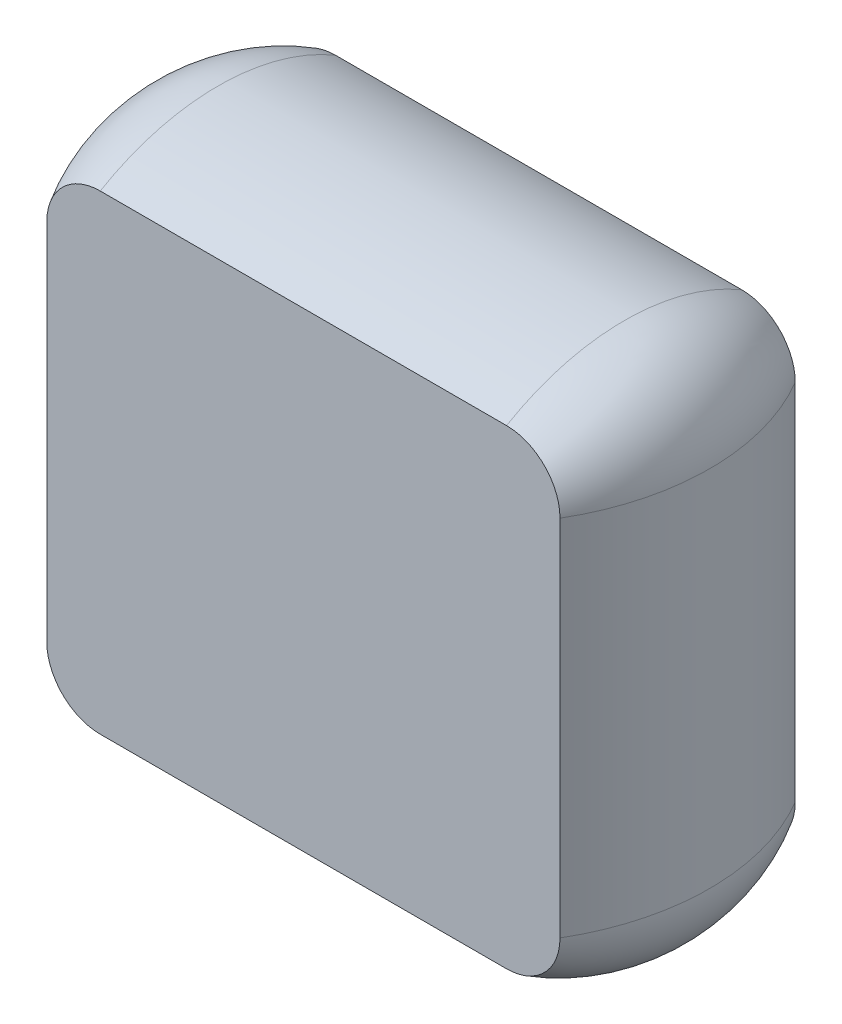
ISO-10303-21;
HEADER;
FILE_DESCRIPTION(('STEP AP214'),'2;1');
FILE_NAME('part.step','',(''),(''),'','','');
FILE_SCHEMA(('AUTOMOTIVE_DESIGN { 1 0 10303 214 1 1 1 1 }'));
ENDSEC;
DATA;
#1=APPLICATION_CONTEXT('core data for automotive mechanical design processes');
#2=APPLICATION_PROTOCOL_DEFINITION('international standard','automotive_design',2000,#1);
#3=PRODUCT_CONTEXT('',#1,'mechanical');
#4=PRODUCT('Part','Part','',(#3));
#5=PRODUCT_RELATED_PRODUCT_CATEGORY('part','',(#4));
#6=PRODUCT_DEFINITION_FORMATION('','',#4);
#7=PRODUCT_DEFINITION_CONTEXT('part definition',#1,'design');
#8=PRODUCT_DEFINITION('design','',#6,#7);
#9=PRODUCT_DEFINITION_SHAPE('','',#8);
#10=(LENGTH_UNIT() NAMED_UNIT(*) SI_UNIT(.MILLI.,.METRE.));
#11=(NAMED_UNIT(*) PLANE_ANGLE_UNIT() SI_UNIT($,.RADIAN.));
#12=(NAMED_UNIT(*) SI_UNIT($,.STERADIAN.) SOLID_ANGLE_UNIT());
#13=UNCERTAINTY_MEASURE_WITH_UNIT(LENGTH_MEASURE(1.E-05),#10,'distance_accuracy_value','');
#14=(GEOMETRIC_REPRESENTATION_CONTEXT(3) GLOBAL_UNCERTAINTY_ASSIGNED_CONTEXT((#13)) GLOBAL_UNIT_ASSIGNED_CONTEXT((#10,
#11,#12)) REPRESENTATION_CONTEXT('',''));
#15=CARTESIAN_POINT('',(0.,0.,0.));
#16=DIRECTION('',(0.,0.,1.));
#17=DIRECTION('',(1.,0.,0.));
#18=AXIS2_PLACEMENT_3D('',#15,#16,#17);
#19=CARTESIAN_POINT('',(27.50000122,80.000000627975,-1.926522083282));
#20=DIRECTION('',(0.,8.74227765658197E-08,-0.999999999999996));
#21=DIRECTION('',(0.,0.999999999999996,8.74227765658197E-08));
#22=AXIS2_PLACEMENT_3D('',#19,#20,#21);
#23=PLANE('',#22);
#24=CARTESIAN_POINT('',(28.450001145691,79.1500005449226,-1.92652215759224));
#25=DIRECTION('',(0.,-8.74240003306815E-08,0.999999999999996));
#26=DIRECTION('',(0.,-0.999999999999996,-8.74240003306815E-08));
#27=AXIS2_PLACEMENT_3D('',#24,#25,#26);
#28=CIRCLE('',#27,0.249999999998537);
#29=CARTESIAN_POINT('',(28.4500011238352,78.900000544924,-1.92652217944813));
#30=VERTEX_POINT('',#29);
#31=CARTESIAN_POINT('',(28.7000011456899,79.1500005230674,-1.92652215759209));
#32=VERTEX_POINT('',#31);
#33=EDGE_CURVE('E21',#30,#32,#28,.T.);
#34=ORIENTED_EDGE('',*,*,#33,.T.);
#35=DIRECTION('',(8.74227767010293E-08,0.999999999999992,8.74227765658193E-08));
#36=VECTOR('',#35,1.);
#37=CARTESIAN_POINT('',(28.7000011456899,79.1500005230679,-1.92652215759194));
#38=LINE('',#37,#36);
#39=CARTESIAN_POINT('',(28.700001294309,80.8500005230675,-1.92652200897359));
#40=VERTEX_POINT('',#39);
#41=EDGE_CURVE('E111',#40,#32,#38,.F.);
#42=ORIENTED_EDGE('',*,*,#41,.F.);
#43=CARTESIAN_POINT('',(28.450001294309,80.8500005449226,-1.92652200897359));
#44=DIRECTION('',(0.,-8.74240020654048E-08,0.999999999999996));
#45=DIRECTION('',(0.,-0.999999999999996,-8.74240020654048E-08));
#46=AXIS2_PLACEMENT_3D('',#43,#44,#45);
#47=CIRCLE('',#46,0.250000000000322);
#48=CARTESIAN_POINT('',(28.4500013161648,81.1000005449233,-1.92652198711742));
#49=VERTEX_POINT('',#48);
#50=EDGE_CURVE('E113',#40,#49,#47,.T.);
#51=ORIENTED_EDGE('',*,*,#50,.T.);
#52=DIRECTION('',(-0.999999999999996,8.74227762310997E-08,0.));
#53=VECTOR('',#52,1.);
#54=CARTESIAN_POINT('',(28.4500013161646,81.1000005449233,-1.92652198711725));
#55=LINE('',#54,#53);
#56=CARTESIAN_POINT('',(26.5500013161648,81.1000007110266,-1.92652198711663));
#57=VERTEX_POINT('',#56);
#58=EDGE_CURVE('E106',#57,#49,#55,.F.);
#59=ORIENTED_EDGE('',*,*,#58,.F.);
#60=CARTESIAN_POINT('',(26.550001294309,80.8500007110256,-1.92652200897203));
#61=DIRECTION('',(0.,-8.74240020654051E-08,0.999999999999996));
#62=DIRECTION('',(0.,-0.999999999999996,-8.74240020654051E-08));
#63=AXIS2_PLACEMENT_3D('',#60,#61,#62);
#64=CIRCLE('',#63,0.250000000001015);
#65=CARTESIAN_POINT('',(26.3000012943098,80.8500007328822,-1.92652200897269));
#66=VERTEX_POINT('',#65);
#67=EDGE_CURVE('E109',#57,#66,#64,.T.);
#68=ORIENTED_EDGE('',*,*,#67,.T.);
#69=DIRECTION('',(-8.74227769561393E-08,-0.999999999999992,-8.74227765658193E-08));
#70=VECTOR('',#69,1.);
#71=CARTESIAN_POINT('',(26.3000012943098,80.8500007328831,-1.92652200897335));
#72=LINE('',#71,#70);
#73=CARTESIAN_POINT('',(26.3000011456911,79.1500007328821,-1.92652215759138));
#74=VERTEX_POINT('',#73);
#75=EDGE_CURVE('E102',#74,#66,#72,.F.);
#76=ORIENTED_EDGE('',*,*,#75,.F.);
#77=CARTESIAN_POINT('',(26.550001145691,79.1500007110256,-1.92652215759069));
#78=DIRECTION('',(0.,-8.74240003306815E-08,0.999999999999996));
#79=DIRECTION('',(0.,-0.999999999999996,-8.74240003306815E-08));
#80=AXIS2_PLACEMENT_3D('',#77,#78,#79);
#81=CIRCLE('',#80,0.249999999999187);
#82=CARTESIAN_POINT('',(26.5500011238351,78.9000007110273,-1.92652217944735));
#83=VERTEX_POINT('',#82);
#84=EDGE_CURVE('E94',#74,#83,#81,.T.);
#85=ORIENTED_EDGE('',*,*,#84,.T.);
#86=DIRECTION('',(0.999999999999996,-8.74227762310997E-08,0.));
#87=VECTOR('',#86,1.);
#88=CARTESIAN_POINT('',(26.5500011238354,78.9000007110273,-1.926522179448));
#89=LINE('',#88,#87);
#90=EDGE_CURVE('E91',#30,#83,#89,.F.);
#91=ORIENTED_EDGE('',*,*,#90,.F.);
#92=EDGE_LOOP('',(#34,#42,#51,#59,#68,#76,#85,#91));
#93=FACE_BOUND('',#92,.T.);
#94=ADVANCED_FACE('F17',(#93),#23,.F.);
#95=CARTESIAN_POINT('',(28.450001145691,79.1500005930058,-2.47652215759351));
#96=DIRECTION('',(0.,-8.74240003306815E-08,0.999999999999996));
#97=DIRECTION('',(0.,-0.999999999999996,-8.74240003306815E-08));
#98=AXIS2_PLACEMENT_3D('',#95,#96,#97);
#99=DEGENERATE_TOROIDAL_SURFACE('',#98,0.683333333333,1.08333333333244,.F.);
#100=CARTESIAN_POINT('',(28.450001145691,79.150000641089,-3.02652215759185));
#101=DIRECTION('',(0.,-8.74240003306815E-08,0.999999999999996));
#102=DIRECTION('',(0.,-0.999999999999996,-8.74240003306815E-08));
#103=AXIS2_PLACEMENT_3D('',#100,#101,#102);
#104=CIRCLE('',#103,0.250000000000271);
#105=CARTESIAN_POINT('',(28.450001134763,78.9000007241406,-3.02652217944784));
#106=VERTEX_POINT('',#105);
#107=CARTESIAN_POINT('',(28.7000011456906,79.150000630161,-3.02652215759169));
#108=VERTEX_POINT('',#107);
#109=EDGE_CURVE('E95',#106,#108,#104,.T.);
#110=ORIENTED_EDGE('',*,*,#109,.T.);
#111=CARTESIAN_POINT('',(27.766667812357,79.1500006527451,-2.476522157592));
#112=DIRECTION('',(8.74227767010293E-08,0.999999999999992,8.74227765658193E-08));
#113=DIRECTION('',(-0.999999999999996,8.74227767010297E-08,0.));
#114=AXIS2_PLACEMENT_3D('',#111,#112,#113);
#115=CIRCLE('',#114,1.083333333333);
#116=EDGE_CURVE('E85',#32,#108,#115,.T.);
#117=ORIENTED_EDGE('',*,*,#116,.F.);
#118=ORIENTED_EDGE('',*,*,#33,.F.);
#119=CARTESIAN_POINT('',(28.4500012054296,79.8333339263397,-2.47652209785301));
#120=DIRECTION('',(0.999999999999996,-8.74227762310997E-08,0.));
#121=DIRECTION('',(8.74227762310997E-08,0.999999999999996,0.));
#122=AXIS2_PLACEMENT_3D('',#119,#120,#121);
#123=CIRCLE('',#122,1.083333333333);
#124=EDGE_CURVE('E84',#106,#30,#123,.F.);
#125=ORIENTED_EDGE('',*,*,#124,.F.);
#126=EDGE_LOOP('',(#110,#117,#118,#125));
#127=FACE_BOUND('',#126,.T.);
#128=ADVANCED_FACE('F83',(#127),#99,.F.);
#129=CARTESIAN_POINT('',(27.766667812357,79.150000652745,-2.476522157592));
#130=DIRECTION('',(8.74227767010293E-08,0.999999999999992,8.74227765658193E-08));
#131=DIRECTION('',(-0.999999999999996,8.74227767010297E-08,0.));
#132=AXIS2_PLACEMENT_3D('',#129,#130,#131);
#133=CYLINDRICAL_SURFACE('',#132,1.083333333333);
#134=CARTESIAN_POINT('',(27.7666679609753,80.8500006527456,-2.476522008973));
#135=DIRECTION('',(-8.74232978632893E-08,-0.999999999999992,-8.7422720577863E-08));
#136=DIRECTION('',(0.861538461538556,-3.09346907064558E-08,-0.507692307692146));
#137=AXIS2_PLACEMENT_3D('',#134,#135,#136);
#138=CIRCLE('',#137,1.08333333333367);
#139=CARTESIAN_POINT('',(28.70000122,80.850000630161,-3.0265220089731));
#140=VERTEX_POINT('',#139);
#141=EDGE_CURVE('E127',#140,#40,#138,.T.);
#142=ORIENTED_EDGE('',*,*,#141,.T.);
#143=ORIENTED_EDGE('',*,*,#41,.T.);
#144=ORIENTED_EDGE('',*,*,#116,.T.);
#145=DIRECTION('',(0.,-0.999999999999996,-8.74227765658197E-08));
#146=VECTOR('',#145,1.);
#147=CARTESIAN_POINT('',(28.700001145691,79.150000641089,-3.026522157592));
#148=LINE('',#147,#146);
#149=EDGE_CURVE('E97',#108,#140,#148,.F.);
#150=ORIENTED_EDGE('',*,*,#149,.T.);
#151=EDGE_LOOP('',(#142,#143,#144,#150));
#152=FACE_BOUND('',#151,.T.);
#153=ADVANCED_FACE('F162',(#152),#133,.T.);
#154=CARTESIAN_POINT('',(28.450001294309,80.8500005930058,-2.47652200897299));
#155=DIRECTION('',(0.,-8.74240020654048E-08,0.999999999999996));
#156=DIRECTION('',(0.,-0.999999999999996,-8.74240020654048E-08));
#157=AXIS2_PLACEMENT_3D('',#154,#155,#156);
#158=DEGENERATE_TOROIDAL_SURFACE('',#157,0.68333333333375,1.08333333333367,.F.);
#159=CARTESIAN_POINT('',(28.450001294309,80.850000641089,-3.0265220089732));
#160=DIRECTION('',(0.,-8.74240020654048E-08,0.999999999999996));
#161=DIRECTION('',(0.,-0.999999999999996,-8.74240020654048E-08));
#162=AXIS2_PLACEMENT_3D('',#159,#160,#161);
#163=CIRCLE('',#162,0.249999999999851);
#164=CARTESIAN_POINT('',(28.450001305237,81.1000006410889,-3.02652198711704));
#165=VERTEX_POINT('',#164);
#166=EDGE_CURVE('E121',#140,#165,#163,.T.);
#167=ORIENTED_EDGE('',*,*,#166,.T.);
#168=CARTESIAN_POINT('',(28.4500012345704,80.166667259673,-2.476522068712));
#169=DIRECTION('',(-0.999999999999996,8.74227762310997E-08,0.));
#170=DIRECTION('',(-8.74227762310997E-08,-0.999999999999996,0.));
#171=AXIS2_PLACEMENT_3D('',#168,#169,#170);
#172=CIRCLE('',#171,1.083333333333);
#173=EDGE_CURVE('E110',#49,#165,#172,.T.);
#174=ORIENTED_EDGE('',*,*,#173,.F.);
#175=ORIENTED_EDGE('',*,*,#50,.F.);
#176=ORIENTED_EDGE('',*,*,#141,.F.);
#177=EDGE_LOOP('',(#167,#174,#175,#176));
#178=FACE_BOUND('',#177,.T.);
#179=ADVANCED_FACE('F161',(#178),#158,.F.);
#180=CARTESIAN_POINT('',(28.45000123457,80.166667259673,-2.476522068712));
#181=DIRECTION('',(-0.999999999999996,8.74227762310997E-08,0.));
#182=DIRECTION('',(-8.74227762310997E-08,-0.999999999999996,0.));
#183=AXIS2_PLACEMENT_3D('',#180,#181,#182);
#184=CYLINDRICAL_SURFACE('',#183,1.083333333333);
#185=CARTESIAN_POINT('',(26.5500012345714,80.1666674257772,-2.47652206871122));
#186=DIRECTION('',(0.999999999999996,-8.74217028733307E-08,0.));
#187=DIRECTION('',(7.53171595604359E-08,0.861538505921933,-0.507692232374887));
#188=AXIS2_PLACEMENT_3D('',#185,#186,#187);
#189=CIRCLE('',#188,1.08333333333247);
#190=CARTESIAN_POINT('',(26.550001305237,81.1000007241404,-3.02652198711715));
#191=VERTEX_POINT('',#190);
#192=EDGE_CURVE('E126',#191,#57,#189,.T.);
#193=ORIENTED_EDGE('',*,*,#192,.T.);
#194=ORIENTED_EDGE('',*,*,#58,.T.);
#195=ORIENTED_EDGE('',*,*,#173,.T.);
#196=DIRECTION('',(1.,0.,0.));
#197=VECTOR('',#196,1.);
#198=CARTESIAN_POINT('',(28.450001145691,81.100000641089,-3.02652198711759));
#199=LINE('',#198,#197);
#200=EDGE_CURVE('E120',#165,#191,#199,.F.);
#201=ORIENTED_EDGE('',*,*,#200,.T.);
#202=EDGE_LOOP('',(#193,#194,#195,#201));
#203=FACE_BOUND('',#202,.T.);
#204=ADVANCED_FACE('F156',(#203),#184,.T.);
#205=CARTESIAN_POINT('',(26.550001294309,80.8500007591088,-2.47652200897148));
#206=DIRECTION('',(0.,-8.74240020654051E-08,0.999999999999996));
#207=DIRECTION('',(0.,-0.999999999999996,-8.74240020654051E-08));
#208=AXIS2_PLACEMENT_3D('',#205,#206,#207);
#209=DEGENERATE_TOROIDAL_SURFACE('',#208,0.68333333333164,1.08333333333247,.F.);
#210=CARTESIAN_POINT('',(26.550001294309,80.850000807192,-3.02652200897334));
#211=DIRECTION('',(0.,-8.74240020654051E-08,0.999999999999996));
#212=DIRECTION('',(0.,-0.999999999999996,-8.74240020654051E-08));
#213=AXIS2_PLACEMENT_3D('',#210,#211,#212);
#214=CIRCLE('',#213,0.249999999999603);
#215=CARTESIAN_POINT('',(26.3000012943094,80.85000081812,-3.02652200897294));
#216=VERTEX_POINT('',#215);
#217=EDGE_CURVE('E117',#191,#216,#214,.T.);
#218=ORIENTED_EDGE('',*,*,#217,.T.);
#219=CARTESIAN_POINT('',(27.233334627643,80.8500006993709,-2.476522008973));
#220=DIRECTION('',(-8.74227769561393E-08,-0.999999999999992,-8.74227765658193E-08));
#221=DIRECTION('',(0.999999999999996,-8.74227769561397E-08,0.));
#222=AXIS2_PLACEMENT_3D('',#219,#220,#221);
#223=CIRCLE('',#222,1.083333333333);
#224=EDGE_CURVE('E105',#66,#216,#223,.T.);
#225=ORIENTED_EDGE('',*,*,#224,.F.);
#226=ORIENTED_EDGE('',*,*,#67,.F.);
#227=ORIENTED_EDGE('',*,*,#192,.F.);
#228=EDGE_LOOP('',(#218,#225,#226,#227));
#229=FACE_BOUND('',#228,.T.);
#230=ADVANCED_FACE('F154',(#229),#209,.F.);
#231=CARTESIAN_POINT('',(27.233334627643,80.850000699371,-2.476522008973));
#232=DIRECTION('',(-8.74227769561393E-08,-0.999999999999992,-8.74227765658193E-08));
#233=DIRECTION('',(0.999999999999996,-8.74227769561397E-08,0.));
#234=AXIS2_PLACEMENT_3D('',#231,#232,#233);
#235=CYLINDRICAL_SURFACE('',#234,1.083333333333);
#236=CARTESIAN_POINT('',(27.2333344790247,79.1500006993733,-2.476522157592));
#237=DIRECTION('',(8.74201721114129E-08,0.999999999999992,8.7422720577863E-08));
#238=DIRECTION('',(-0.861538461538554,1.19699686060467E-07,-0.507692307692136));
#239=AXIS2_PLACEMENT_3D('',#236,#237,#238);
#240=CIRCLE('',#239,1.08333333333367);
#241=CARTESIAN_POINT('',(26.30000122,79.15000081812,-3.02652215759198));
#242=VERTEX_POINT('',#241);
#243=EDGE_CURVE('E125',#242,#74,#240,.T.);
#244=ORIENTED_EDGE('',*,*,#243,.T.);
#245=ORIENTED_EDGE('',*,*,#75,.T.);
#246=ORIENTED_EDGE('',*,*,#224,.T.);
#247=DIRECTION('',(0.,-0.999999999999996,-8.74227765658197E-08));
#248=VECTOR('',#247,1.);
#249=CARTESIAN_POINT('',(26.300001294309,79.150000641089,-3.026522157592));
#250=LINE('',#249,#248);
#251=EDGE_CURVE('E116',#216,#242,#250,.T.);
#252=ORIENTED_EDGE('',*,*,#251,.T.);
#253=EDGE_LOOP('',(#244,#245,#246,#252));
#254=FACE_BOUND('',#253,.T.);
#255=ADVANCED_FACE('F146',(#254),#235,.T.);
#256=CARTESIAN_POINT('',(26.550001145691,79.1500007591088,-2.476522157592));
#257=DIRECTION('',(0.,-8.74240003306815E-08,0.999999999999996));
#258=DIRECTION('',(0.,-0.999999999999996,-8.74240003306815E-08));
#259=AXIS2_PLACEMENT_3D('',#256,#257,#258);
#260=DEGENERATE_TOROIDAL_SURFACE('',#259,0.68333333333376,1.08333333333367,.F.);
#261=CARTESIAN_POINT('',(26.550001145691,79.150000807192,-3.02652215759198));
#262=DIRECTION('',(0.,-8.74240003306815E-08,0.999999999999996));
#263=DIRECTION('',(0.,-0.999999999999996,-8.74240003306815E-08));
#264=AXIS2_PLACEMENT_3D('',#261,#262,#263);
#265=CIRCLE('',#264,0.249999999999979);
#266=CARTESIAN_POINT('',(26.550001134763,78.9000008071923,-3.02652217944781));
#267=VERTEX_POINT('',#266);
#268=EDGE_CURVE('E27',#242,#267,#265,.T.);
#269=ORIENTED_EDGE('',*,*,#268,.T.);
#270=CARTESIAN_POINT('',(26.5500012054296,79.833334092443,-2.476522097853));
#271=DIRECTION('',(0.999999999999996,-8.74227762310997E-08,0.));
#272=DIRECTION('',(8.74227762310997E-08,0.999999999999996,0.));
#273=AXIS2_PLACEMENT_3D('',#270,#271,#272);
#274=CIRCLE('',#273,1.083333333333);
#275=EDGE_CURVE('E35',#83,#267,#274,.T.);
#276=ORIENTED_EDGE('',*,*,#275,.F.);
#277=ORIENTED_EDGE('',*,*,#84,.F.);
#278=ORIENTED_EDGE('',*,*,#243,.F.);
#279=EDGE_LOOP('',(#269,#276,#277,#278));
#280=FACE_BOUND('',#279,.T.);
#281=ADVANCED_FACE('F19',(#280),#260,.F.);
#282=CARTESIAN_POINT('',(26.55000120543,79.833334092443,-2.476522097853));
#283=DIRECTION('',(0.999999999999996,-8.74227762310997E-08,0.));
#284=DIRECTION('',(8.74227762310997E-08,0.999999999999996,0.));
#285=AXIS2_PLACEMENT_3D('',#282,#283,#284);
#286=CYLINDRICAL_SURFACE('',#285,1.083333333333);
#287=ORIENTED_EDGE('',*,*,#124,.T.);
#288=ORIENTED_EDGE('',*,*,#90,.T.);
#289=ORIENTED_EDGE('',*,*,#275,.T.);
#290=DIRECTION('',(1.,0.,0.));
#291=VECTOR('',#290,1.);
#292=CARTESIAN_POINT('',(28.450001145691,78.900000807192,-3.02652217944768));
#293=LINE('',#292,#291);
#294=EDGE_CURVE('E11',#267,#106,#293,.T.);
#295=ORIENTED_EDGE('',*,*,#294,.T.);
#296=EDGE_LOOP('',(#287,#288,#289,#295));
#297=FACE_BOUND('',#296,.T.);
#298=ADVANCED_FACE('F90',(#297),#286,.T.);
#299=CARTESIAN_POINT('',(28.450001145691,79.150000641089,-3.026522157592));
#300=DIRECTION('',(0.,-8.74227765658197E-08,0.999999999999996));
#301=DIRECTION('',(0.,-0.999999999999996,-8.74227765658197E-08));
#302=AXIS2_PLACEMENT_3D('',#299,#300,#301);
#303=PLANE('',#302);
#304=ORIENTED_EDGE('',*,*,#268,.F.);
#305=ORIENTED_EDGE('',*,*,#251,.F.);
#306=ORIENTED_EDGE('',*,*,#217,.F.);
#307=ORIENTED_EDGE('',*,*,#200,.F.);
#308=ORIENTED_EDGE('',*,*,#166,.F.);
#309=ORIENTED_EDGE('',*,*,#149,.F.);
#310=ORIENTED_EDGE('',*,*,#109,.F.);
#311=ORIENTED_EDGE('',*,*,#294,.F.);
#312=EDGE_LOOP('',(#304,#305,#306,#307,#308,#309,#310,#311));
#313=FACE_BOUND('',#312,.T.);
#314=ADVANCED_FACE('F151',(#313),#303,.F.);
#315=CLOSED_SHELL('',(#94,#128,#153,#179,#204,#230,#255,#281,#298,#314));
#316=MANIFOLD_SOLID_BREP('B1',#315);
#317=ADVANCED_BREP_SHAPE_REPRESENTATION('',(#18,#316),#14);
#318=SHAPE_DEFINITION_REPRESENTATION(#9,#317);
ENDSEC;
END-ISO-10303-21;
